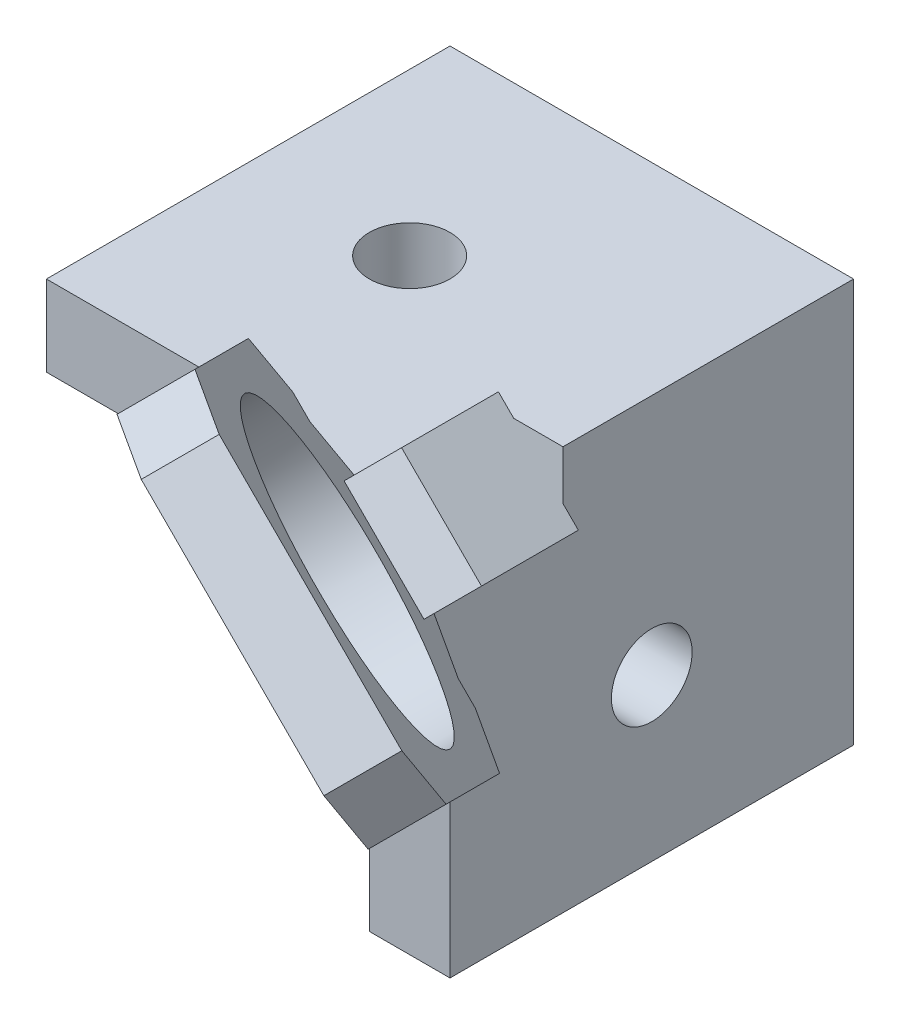
ISO-10303-21;
HEADER;
FILE_DESCRIPTION(('STEP AP214'),'2;1');
FILE_NAME('part.step','',(''),(''),'','','');
FILE_SCHEMA(('AUTOMOTIVE_DESIGN { 1 0 10303 214 1 1 1 1 }'));
ENDSEC;
DATA;
#1=APPLICATION_CONTEXT('core data for automotive mechanical design processes');
#2=APPLICATION_PROTOCOL_DEFINITION('international standard','automotive_design',2000,#1);
#3=PRODUCT_CONTEXT('',#1,'mechanical');
#4=PRODUCT('Part','Part','',(#3));
#5=PRODUCT_RELATED_PRODUCT_CATEGORY('part','',(#4));
#6=PRODUCT_DEFINITION_FORMATION('','',#4);
#7=PRODUCT_DEFINITION_CONTEXT('part definition',#1,'design');
#8=PRODUCT_DEFINITION('design','',#6,#7);
#9=PRODUCT_DEFINITION_SHAPE('','',#8);
#10=(LENGTH_UNIT() NAMED_UNIT(*) SI_UNIT(.MILLI.,.METRE.));
#11=(NAMED_UNIT(*) PLANE_ANGLE_UNIT() SI_UNIT($,.RADIAN.));
#12=(NAMED_UNIT(*) SI_UNIT($,.STERADIAN.) SOLID_ANGLE_UNIT());
#13=UNCERTAINTY_MEASURE_WITH_UNIT(LENGTH_MEASURE(1.E-05),#10,'distance_accuracy_value','');
#14=(GEOMETRIC_REPRESENTATION_CONTEXT(3) GLOBAL_UNCERTAINTY_ASSIGNED_CONTEXT((#13)) GLOBAL_UNIT_ASSIGNED_CONTEXT((#10,
#11,#12)) REPRESENTATION_CONTEXT('',''));
#15=CARTESIAN_POINT('',(0.,0.,0.));
#16=DIRECTION('',(0.,0.,1.));
#17=DIRECTION('',(1.,0.,0.));
#18=AXIS2_PLACEMENT_3D('',#15,#16,#17);
#19=CARTESIAN_POINT('',(0.,0.,25.));
#20=DIRECTION('',(0.,0.,1.));
#21=DIRECTION('',(1.,0.,0.));
#22=AXIS2_PLACEMENT_3D('',#19,#20,#21);
#23=PLANE('',#22);
#24=DIRECTION('',(0.,1.,0.));
#25=VECTOR('',#24,1.);
#26=CARTESIAN_POINT('',(12.5,-12.5,25.));
#27=LINE('',#26,#25);
#28=CARTESIAN_POINT('',(12.5,-12.5,25.));
#29=VERTEX_POINT('',#28);
#30=CARTESIAN_POINT('',(12.5,1.89339828220175,25.));
#31=VERTEX_POINT('',#30);
#32=EDGE_CURVE('E308',#29,#31,#27,.T.);
#33=ORIENTED_EDGE('',*,*,#32,.T.);
#34=DIRECTION('',(-0.707106781186548,0.707106781186547,0.));
#35=VECTOR('',#34,1.);
#36=CARTESIAN_POINT('',(4.72182540694795,9.67157287525379,25.));
#37=LINE('',#36,#35);
#38=CARTESIAN_POINT('',(7.5,6.89339828220174,25.));
#39=VERTEX_POINT('',#38);
#40=EDGE_CURVE('E358',#31,#39,#37,.T.);
#41=ORIENTED_EDGE('',*,*,#40,.T.);
#42=DIRECTION('',(0.,1.,0.));
#43=VECTOR('',#42,1.);
#44=CARTESIAN_POINT('',(7.5,-12.5,25.));
#45=LINE('',#44,#43);
#46=CARTESIAN_POINT('',(7.5,-12.5,25.));
#47=VERTEX_POINT('',#46);
#48=EDGE_CURVE('E265',#47,#39,#45,.T.);
#49=ORIENTED_EDGE('',*,*,#48,.F.);
#50=DIRECTION('',(1.,0.,0.));
#51=VECTOR('',#50,1.);
#52=CARTESIAN_POINT('',(12.5,-12.5,25.));
#53=LINE('',#52,#51);
#54=EDGE_CURVE('E304',#47,#29,#53,.T.);
#55=ORIENTED_EDGE('',*,*,#54,.T.);
#56=EDGE_LOOP('',(#33,#41,#49,#55));
#57=FACE_BOUND('',#56,.T.);
#58=ADVANCED_FACE('F47',(#57),#23,.T.);
#59=CARTESIAN_POINT('',(0.,0.,22.));
#60=DIRECTION('',(0.,0.,1.));
#61=DIRECTION('',(1.,0.,0.));
#62=AXIS2_PLACEMENT_3D('',#59,#60,#61);
#63=PLANE('',#62);
#64=DIRECTION('',(-0.707106781186548,0.707106781186547,0.));
#65=VECTOR('',#64,1.);
#66=CARTESIAN_POINT('',(17.4497474683058,12.5,22.));
#67=LINE('',#66,#65);
#68=CARTESIAN_POINT('',(13.4497474683058,16.5000000000001,22.));
#69=VERTEX_POINT('',#68);
#70=CARTESIAN_POINT('',(12.5,17.4497474683058,22.));
#71=VERTEX_POINT('',#70);
#72=EDGE_CURVE('E779',#69,#71,#67,.T.);
#73=ORIENTED_EDGE('',*,*,#72,.F.);
#74=DIRECTION('',(-1.,0.,0.));
#75=VECTOR('',#74,1.);
#76=CARTESIAN_POINT('',(7.55025253169416,16.5000000000001,22.));
#77=LINE('',#76,#75);
#78=CARTESIAN_POINT('',(11.5502525316942,16.5000000000001,22.));
#79=VERTEX_POINT('',#78);
#80=EDGE_CURVE('E342',#69,#79,#77,.T.);
#81=ORIENTED_EDGE('',*,*,#80,.T.);
#82=DIRECTION('',(-0.707106781186547,-0.707106781186548,0.));
#83=VECTOR('',#82,1.);
#84=CARTESIAN_POINT('',(12.5,17.4497474683058,22.));
#85=LINE('',#84,#83);
#86=EDGE_CURVE('E774',#71,#79,#85,.T.);
#87=ORIENTED_EDGE('',*,*,#86,.F.);
#88=EDGE_LOOP('',(#73,#81,#87));
#89=FACE_BOUND('',#88,.T.);
#90=ADVANCED_FACE('F627',(#89),#63,.F.);
#91=CARTESIAN_POINT('',(12.5,17.4497474683058,22.));
#92=DIRECTION('',(-0.707106781186548,0.707106781186547,0.));
#93=DIRECTION('',(-0.707106781186547,-0.707106781186548,0.));
#94=AXIS2_PLACEMENT_3D('',#91,#92,#93);
#95=PLANE('',#94);
#96=DIRECTION('',(-0.499999999999998,-0.499999999999999,-0.70710678118655));
#97=VECTOR('',#96,1.);
#98=CARTESIAN_POINT('',(8.56244584051399,13.5121933088198,30.4314575050764));
#99=LINE('',#98,#97);
#100=CARTESIAN_POINT('',(7.55025253169416,12.5,29.0000000000001));
#101=VERTEX_POINT('',#100);
#102=CARTESIAN_POINT('',(8.17157287525378,13.1213203435596,29.8786796564404));
#103=VERTEX_POINT('',#102);
#104=EDGE_CURVE('E391',#101,#103,#99,.F.);
#105=ORIENTED_EDGE('',*,*,#104,.T.);
#106=DIRECTION('',(0.499999999999997,0.499999999999998,-0.707106781186551));
#107=VECTOR('',#106,1.);
#108=CARTESIAN_POINT('',(13.1213203435596,18.0710678118655,22.8786796564403));
#109=LINE('',#108,#107);
#110=CARTESIAN_POINT('',(9.52512626584708,14.4748737341529,27.9644660940672));
#111=VERTEX_POINT('',#110);
#112=EDGE_CURVE('E470',#103,#111,#109,.T.);
#113=ORIENTED_EDGE('',*,*,#112,.T.);
#114=DIRECTION('',(0.500000000000002,0.500000000000003,0.707106781186544));
#115=VECTOR('',#114,1.);
#116=CARTESIAN_POINT('',(22.0251262658471,26.974873734153,45.6421356237308));
#117=LINE('',#116,#115);
#118=CARTESIAN_POINT('',(11.0251262658471,15.9748737341529,30.0857864376269));
#119=VERTEX_POINT('',#118);
#120=EDGE_CURVE('E467',#111,#119,#117,.T.);
#121=ORIENTED_EDGE('',*,*,#120,.T.);
#122=DIRECTION('',(-0.499999999999997,-0.499999999999998,0.707106781186551));
#123=VECTOR('',#122,1.);
#124=CARTESIAN_POINT('',(14.6213203435596,19.5710678118655,24.9999999999999));
#125=LINE('',#124,#123);
#126=CARTESIAN_POINT('',(12.5,17.4497474683058,27.9999999999999));
#127=VERTEX_POINT('',#126);
#128=EDGE_CURVE('E255',#127,#119,#125,.T.);
#129=ORIENTED_EDGE('',*,*,#128,.F.);
#130=DIRECTION('',(0.,0.,1.));
#131=VECTOR('',#130,1.);
#132=CARTESIAN_POINT('',(12.5,17.4497474683058,22.));
#133=LINE('',#132,#131);
#134=EDGE_CURVE('E253',#71,#127,#133,.T.);
#135=ORIENTED_EDGE('',*,*,#134,.F.);
#136=ORIENTED_EDGE('',*,*,#86,.T.);
#137=DIRECTION('',(0.577350269189627,0.577350269189628,0.577350269189622));
#138=VECTOR('',#137,1.);
#139=CARTESIAN_POINT('',(7.70016835446279,12.6499158227686,18.1499158227686));
#140=LINE('',#139,#138);
#141=CARTESIAN_POINT('',(7.55025253169416,12.5,18.));
#142=VERTEX_POINT('',#141);
#143=EDGE_CURVE('E361',#79,#142,#140,.F.);
#144=ORIENTED_EDGE('',*,*,#143,.T.);
#145=DIRECTION('',(0.,0.,1.));
#146=VECTOR('',#145,1.);
#147=CARTESIAN_POINT('',(7.55025253169416,12.5,22.));
#148=LINE('',#147,#146);
#149=EDGE_CURVE('E268',#142,#101,#148,.T.);
#150=ORIENTED_EDGE('',*,*,#149,.T.);
#151=EDGE_LOOP('',(#105,#113,#121,#129,#135,#136,#144,#150));
#152=FACE_BOUND('',#151,.T.);
#153=ADVANCED_FACE('F496',(#152),#95,.T.);
#154=CARTESIAN_POINT('',(12.5,7.55025253169417,22.));
#155=DIRECTION('',(0.707106781186548,-0.707106781186547,0.));
#156=DIRECTION('',(0.707106781186547,0.707106781186548,0.));
#157=AXIS2_PLACEMENT_3D('',#154,#155,#156);
#158=PLANE('',#157);
#159=DIRECTION('',(0.499999999999997,0.499999999999998,-0.707106781186551));
#160=VECTOR('',#159,1.);
#161=CARTESIAN_POINT('',(19.8618055378411,14.9120580695353,24.5888347648317));
#162=LINE('',#161,#160);
#163=CARTESIAN_POINT('',(15.9748737341529,11.0251262658471,30.0857864376269));
#164=VERTEX_POINT('',#163);
#165=CARTESIAN_POINT('',(17.4497474683058,12.5,27.9999999999999));
#166=VERTEX_POINT('',#165);
#167=EDGE_CURVE('E231',#164,#166,#162,.T.);
#168=ORIENTED_EDGE('',*,*,#167,.F.);
#169=DIRECTION('',(-0.500000000000002,-0.500000000000003,-0.707106781186544));
#170=VECTOR('',#169,1.);
#171=CARTESIAN_POINT('',(26.974873734153,22.0251262658472,45.6421356237309));
#172=LINE('',#171,#170);
#173=CARTESIAN_POINT('',(14.4748737341529,9.52512626584708,27.9644660940672));
#174=VERTEX_POINT('',#173);
#175=EDGE_CURVE('E464',#164,#174,#172,.T.);
#176=ORIENTED_EDGE('',*,*,#175,.T.);
#177=DIRECTION('',(-0.499999999999997,-0.499999999999998,0.707106781186551));
#178=VECTOR('',#177,1.);
#179=CARTESIAN_POINT('',(15.5961940777125,10.6464466094067,26.3786796564403));
#180=LINE('',#179,#178);
#181=CARTESIAN_POINT('',(13.1213203435596,8.17157287525379,29.8786796564404));
#182=VERTEX_POINT('',#181);
#183=EDGE_CURVE('E461',#174,#182,#180,.T.);
#184=ORIENTED_EDGE('',*,*,#183,.T.);
#185=DIRECTION('',(0.499999999999998,0.499999999999999,0.70710678118655));
#186=VECTOR('',#185,1.);
#187=CARTESIAN_POINT('',(13.5121933088198,8.56244584051399,30.4314575050764));
#188=LINE('',#187,#186);
#189=CARTESIAN_POINT('',(12.5,7.55025253169417,29.0000000000001));
#190=VERTEX_POINT('',#189);
#191=EDGE_CURVE('E374',#182,#190,#188,.F.);
#192=ORIENTED_EDGE('',*,*,#191,.T.);
#193=DIRECTION('',(0.,0.,1.));
#194=VECTOR('',#193,1.);
#195=CARTESIAN_POINT('',(12.5,7.55025253169417,22.));
#196=LINE('',#195,#194);
#197=CARTESIAN_POINT('',(12.5,7.55025253169417,18.));
#198=VERTEX_POINT('',#197);
#199=EDGE_CURVE('E261',#198,#190,#196,.T.);
#200=ORIENTED_EDGE('',*,*,#199,.F.);
#201=DIRECTION('',(-0.577350269189628,-0.577350269189628,-0.577350269189622));
#202=VECTOR('',#201,1.);
#203=CARTESIAN_POINT('',(12.6499158227686,7.7001683544628,18.1499158227686));
#204=LINE('',#203,#202);
#205=CARTESIAN_POINT('',(16.5000000000001,11.5502525316942,22.));
#206=VERTEX_POINT('',#205);
#207=EDGE_CURVE('E371',#198,#206,#204,.F.);
#208=ORIENTED_EDGE('',*,*,#207,.T.);
#209=DIRECTION('',(0.707106781186547,0.707106781186548,0.));
#210=VECTOR('',#209,1.);
#211=CARTESIAN_POINT('',(12.5,7.55025253169417,22.));
#212=LINE('',#211,#210);
#213=CARTESIAN_POINT('',(17.4497474683058,12.5,22.));
#214=VERTEX_POINT('',#213);
#215=EDGE_CURVE('E259',#206,#214,#212,.T.);
#216=ORIENTED_EDGE('',*,*,#215,.T.);
#217=DIRECTION('',(0.,0.,1.));
#218=VECTOR('',#217,1.);
#219=CARTESIAN_POINT('',(17.4497474683058,12.5,22.));
#220=LINE('',#219,#218);
#221=EDGE_CURVE('E250',#214,#166,#220,.T.);
#222=ORIENTED_EDGE('',*,*,#221,.T.);
#223=EDGE_LOOP('',(#168,#176,#184,#192,#200,#208,#216,#222));
#224=FACE_BOUND('',#223,.T.);
#225=ADVANCED_FACE('F257',(#224),#158,.T.);
#226=CARTESIAN_POINT('',(-12.5,-12.5,25.));
#227=DIRECTION('',(1.,0.,0.));
#228=DIRECTION('',(0.,0.,-1.));
#229=AXIS2_PLACEMENT_3D('',#226,#227,#228);
#230=PLANE('',#229);
#231=DIRECTION('',(0.,-1.,0.));
#232=VECTOR('',#231,1.);
#233=CARTESIAN_POINT('',(-12.5,-12.5,0.));
#234=LINE('',#233,#232);
#235=CARTESIAN_POINT('',(-12.5,12.5,0.));
#236=VERTEX_POINT('',#235);
#237=CARTESIAN_POINT('',(-12.5,7.5,0.));
#238=VERTEX_POINT('',#237);
#239=EDGE_CURVE('E294',#236,#238,#234,.T.);
#240=ORIENTED_EDGE('',*,*,#239,.T.);
#241=DIRECTION('',(0.,0.,1.));
#242=VECTOR('',#241,1.);
#243=CARTESIAN_POINT('',(-12.5,7.5,0.));
#244=LINE('',#243,#242);
#245=CARTESIAN_POINT('',(-12.5,7.5,25.));
#246=VERTEX_POINT('',#245);
#247=EDGE_CURVE('E290',#238,#246,#244,.T.);
#248=ORIENTED_EDGE('',*,*,#247,.T.);
#249=DIRECTION('',(0.,-1.,0.));
#250=VECTOR('',#249,1.);
#251=CARTESIAN_POINT('',(-12.5,-12.5,25.));
#252=LINE('',#251,#250);
#253=CARTESIAN_POINT('',(-12.5,12.5,25.));
#254=VERTEX_POINT('',#253);
#255=EDGE_CURVE('E300',#254,#246,#252,.T.);
#256=ORIENTED_EDGE('',*,*,#255,.F.);
#257=DIRECTION('',(0.,0.,-1.));
#258=VECTOR('',#257,1.);
#259=CARTESIAN_POINT('',(-12.5,12.5,25.));
#260=LINE('',#259,#258);
#261=EDGE_CURVE('E315',#254,#236,#260,.T.);
#262=ORIENTED_EDGE('',*,*,#261,.T.);
#263=EDGE_LOOP('',(#240,#248,#256,#262));
#264=FACE_BOUND('',#263,.T.);
#265=ADVANCED_FACE('F588',(#264),#230,.F.);
#266=CARTESIAN_POINT('',(12.5,-12.5,25.));
#267=DIRECTION('',(0.,1.,0.));
#268=DIRECTION('',(-1.,0.,0.));
#269=AXIS2_PLACEMENT_3D('',#266,#267,#268);
#270=PLANE('',#269);
#271=ORIENTED_EDGE('',*,*,#54,.F.);
#272=DIRECTION('',(0.,0.,1.));
#273=VECTOR('',#272,1.);
#274=CARTESIAN_POINT('',(7.5,-12.5,0.));
#275=LINE('',#274,#273);
#276=CARTESIAN_POINT('',(7.5,-12.5,0.));
#277=VERTEX_POINT('',#276);
#278=EDGE_CURVE('E284',#277,#47,#275,.T.);
#279=ORIENTED_EDGE('',*,*,#278,.F.);
#280=DIRECTION('',(1.,0.,0.));
#281=VECTOR('',#280,1.);
#282=CARTESIAN_POINT('',(12.5,-12.5,0.));
#283=LINE('',#282,#281);
#284=CARTESIAN_POINT('',(12.5,-12.5,0.));
#285=VERTEX_POINT('',#284);
#286=EDGE_CURVE('E319',#277,#285,#283,.T.);
#287=ORIENTED_EDGE('',*,*,#286,.T.);
#288=DIRECTION('',(0.,0.,-1.));
#289=VECTOR('',#288,1.);
#290=CARTESIAN_POINT('',(12.5,-12.5,25.));
#291=LINE('',#290,#289);
#292=EDGE_CURVE('E334',#29,#285,#291,.T.);
#293=ORIENTED_EDGE('',*,*,#292,.F.);
#294=EDGE_LOOP('',(#271,#279,#287,#293));
#295=FACE_BOUND('',#294,.T.);
#296=ADVANCED_FACE('F596',(#295),#270,.F.);
#297=CARTESIAN_POINT('',(12.5,-12.5,25.));
#298=DIRECTION('',(-1.,0.,0.));
#299=DIRECTION('',(0.,0.,1.));
#300=AXIS2_PLACEMENT_3D('',#297,#298,#299);
#301=PLANE('',#300);
#302=CARTESIAN_POINT('',(12.5,-2.5,12.5));
#303=DIRECTION('',(-1.,0.,0.));
#304=DIRECTION('',(0.,0.,1.));
#305=AXIS2_PLACEMENT_3D('',#302,#303,#304);
#306=CIRCLE('',#305,2.5);
#307=CARTESIAN_POINT('',(12.5,-2.5,15.));
#308=VERTEX_POINT('',#307);
#309=EDGE_CURVE('E553',#308,#308,#306,.T.);
#310=ORIENTED_EDGE('',*,*,#309,.T.);
#311=EDGE_LOOP('',(#310));
#312=FACE_BOUND('',#311,.T.);
#313=DIRECTION('',(0.,0.,-1.));
#314=VECTOR('',#313,1.);
#315=CARTESIAN_POINT('',(12.5,12.5,25.));
#316=LINE('',#315,#314);
#317=CARTESIAN_POINT('',(12.5,12.5,18.));
#318=VERTEX_POINT('',#317);
#319=CARTESIAN_POINT('',(12.5,12.5,0.));
#320=VERTEX_POINT('',#319);
#321=EDGE_CURVE('E331',#318,#320,#316,.T.);
#322=ORIENTED_EDGE('',*,*,#321,.F.);
#323=DIRECTION('',(0.,-1.,0.));
#324=VECTOR('',#323,1.);
#325=CARTESIAN_POINT('',(12.5,7.55025253169418,18.));
#326=LINE('',#325,#324);
#327=EDGE_CURVE('E349',#318,#198,#326,.T.);
#328=ORIENTED_EDGE('',*,*,#327,.T.);
#329=ORIENTED_EDGE('',*,*,#199,.T.);
#330=DIRECTION('',(0.,0.816496580927724,0.577350269189629));
#331=VECTOR('',#330,1.);
#332=CARTESIAN_POINT('',(12.5,-7.70220057259936,18.2148869802242));
#333=LINE('',#332,#331);
#334=EDGE_CURVE('E377',#190,#31,#333,.F.);
#335=ORIENTED_EDGE('',*,*,#334,.T.);
#336=ORIENTED_EDGE('',*,*,#32,.F.);
#337=ORIENTED_EDGE('',*,*,#292,.T.);
#338=DIRECTION('',(0.,1.,0.));
#339=VECTOR('',#338,1.);
#340=CARTESIAN_POINT('',(12.5,-12.5,0.));
#341=LINE('',#340,#339);
#342=EDGE_CURVE('E322',#285,#320,#341,.T.);
#343=ORIENTED_EDGE('',*,*,#342,.T.);
#344=EDGE_LOOP('',(#322,#328,#329,#335,#336,#337,#343));
#345=FACE_BOUND('',#344,.T.);
#346=ADVANCED_FACE('F601',(#312,#345),#301,.F.);
#347=CARTESIAN_POINT('',(12.5,12.5,25.));
#348=DIRECTION('',(0.,-1.,0.));
#349=DIRECTION('',(1.,0.,0.));
#350=AXIS2_PLACEMENT_3D('',#347,#348,#349);
#351=PLANE('',#350);
#352=CARTESIAN_POINT('',(-2.5,12.5,12.5));
#353=DIRECTION('',(0.,-1.,0.));
#354=DIRECTION('',(1.,0.,0.));
#355=AXIS2_PLACEMENT_3D('',#352,#353,#354);
#356=CIRCLE('',#355,2.5);
#357=CARTESIAN_POINT('',(0.,12.5,12.5));
#358=VERTEX_POINT('',#357);
#359=EDGE_CURVE('E401',#358,#358,#356,.T.);
#360=ORIENTED_EDGE('',*,*,#359,.T.);
#361=EDGE_LOOP('',(#360));
#362=FACE_BOUND('',#361,.T.);
#363=ORIENTED_EDGE('',*,*,#149,.F.);
#364=DIRECTION('',(1.,0.,0.));
#365=VECTOR('',#364,1.);
#366=CARTESIAN_POINT('',(12.5,12.5,18.));
#367=LINE('',#366,#365);
#368=EDGE_CURVE('E346',#142,#318,#367,.T.);
#369=ORIENTED_EDGE('',*,*,#368,.T.);
#370=ORIENTED_EDGE('',*,*,#321,.T.);
#371=DIRECTION('',(-1.,0.,0.));
#372=VECTOR('',#371,1.);
#373=CARTESIAN_POINT('',(12.5,12.5,0.));
#374=LINE('',#373,#372);
#375=EDGE_CURVE('E305',#320,#236,#374,.T.);
#376=ORIENTED_EDGE('',*,*,#375,.T.);
#377=ORIENTED_EDGE('',*,*,#261,.F.);
#378=DIRECTION('',(-1.,0.,0.));
#379=VECTOR('',#378,1.);
#380=CARTESIAN_POINT('',(12.5,12.5,25.));
#381=LINE('',#380,#379);
#382=CARTESIAN_POINT('',(1.89339828220173,12.5,25.));
#383=VERTEX_POINT('',#382);
#384=EDGE_CURVE('E312',#383,#254,#381,.T.);
#385=ORIENTED_EDGE('',*,*,#384,.F.);
#386=DIRECTION('',(-0.816496580927724,0.,-0.577350269189628));
#387=VECTOR('',#386,1.);
#388=CARTESIAN_POINT('',(8.96446609406721,12.5,30.));
#389=LINE('',#388,#387);
#390=EDGE_CURVE('E387',#383,#101,#389,.F.);
#391=ORIENTED_EDGE('',*,*,#390,.T.);
#392=EDGE_LOOP('',(#363,#369,#370,#376,#377,#385,#391));
#393=FACE_BOUND('',#392,.T.);
#394=ADVANCED_FACE('F636',(#362,#393),#351,.F.);
#395=DIRECTION('',(-1.,0.,0.));
#396=VECTOR('',#395,1.);
#397=CARTESIAN_POINT('',(-12.5,7.5,25.));
#398=LINE('',#397,#396);
#399=CARTESIAN_POINT('',(6.89339828220174,7.5,25.));
#400=VERTEX_POINT('',#399);
#401=EDGE_CURVE('E280',#400,#246,#398,.T.);
#402=ORIENTED_EDGE('',*,*,#401,.F.);
#403=DIRECTION('',(-0.707106781186548,0.707106781186547,0.));
#404=VECTOR('',#403,1.);
#405=CARTESIAN_POINT('',(4.72182540694795,9.67157287525379,25.));
#406=LINE('',#405,#404);
#407=EDGE_CURVE('E355',#400,#383,#406,.T.);
#408=ORIENTED_EDGE('',*,*,#407,.T.);
#409=ORIENTED_EDGE('',*,*,#384,.T.);
#410=ORIENTED_EDGE('',*,*,#255,.T.);
#411=EDGE_LOOP('',(#402,#408,#409,#410));
#412=FACE_BOUND('',#411,.T.);
#413=ADVANCED_FACE('F583',(#412),#23,.T.);
#414=CARTESIAN_POINT('',(0.,0.,0.));
#415=DIRECTION('',(0.,0.,1.));
#416=DIRECTION('',(1.,0.,0.));
#417=AXIS2_PLACEMENT_3D('',#414,#415,#416);
#418=PLANE('',#417);
#419=DIRECTION('',(0.,1.,0.));
#420=VECTOR('',#419,1.);
#421=CARTESIAN_POINT('',(7.5,-12.5,0.));
#422=LINE('',#421,#420);
#423=CARTESIAN_POINT('',(7.5,7.5,0.));
#424=VERTEX_POINT('',#423);
#425=EDGE_CURVE('E275',#277,#424,#422,.T.);
#426=ORIENTED_EDGE('',*,*,#425,.T.);
#427=DIRECTION('',(-1.,0.,0.));
#428=VECTOR('',#427,1.);
#429=CARTESIAN_POINT('',(-12.5,7.5,0.));
#430=LINE('',#429,#428);
#431=EDGE_CURVE('E279',#424,#238,#430,.T.);
#432=ORIENTED_EDGE('',*,*,#431,.T.);
#433=ORIENTED_EDGE('',*,*,#239,.F.);
#434=ORIENTED_EDGE('',*,*,#375,.F.);
#435=ORIENTED_EDGE('',*,*,#342,.F.);
#436=ORIENTED_EDGE('',*,*,#286,.F.);
#437=EDGE_LOOP('',(#426,#432,#433,#434,#435,#436));
#438=FACE_BOUND('',#437,.T.);
#439=ADVANCED_FACE('F591',(#438),#418,.F.);
#440=CARTESIAN_POINT('',(-12.5,7.5,0.));
#441=DIRECTION('',(0.,1.,0.));
#442=DIRECTION('',(0.,0.,1.));
#443=AXIS2_PLACEMENT_3D('',#440,#441,#442);
#444=PLANE('',#443);
#445=CARTESIAN_POINT('',(-2.5,7.5,12.5));
#446=DIRECTION('',(0.,-1.,0.));
#447=DIRECTION('',(0.,0.,-1.));
#448=AXIS2_PLACEMENT_3D('',#445,#446,#447);
#449=CIRCLE('',#448,2.5);
#450=CARTESIAN_POINT('',(-2.5,7.5,10.));
#451=VERTEX_POINT('',#450);
#452=EDGE_CURVE('E549',#451,#451,#449,.T.);
#453=ORIENTED_EDGE('',*,*,#452,.F.);
#454=EDGE_LOOP('',(#453));
#455=FACE_BOUND('',#454,.T.);
#456=DIRECTION('',(0.,0.,1.));
#457=VECTOR('',#456,1.);
#458=CARTESIAN_POINT('',(7.5,7.5,0.));
#459=LINE('',#458,#457);
#460=CARTESIAN_POINT('',(7.5,7.5,25.4289321881346));
#461=VERTEX_POINT('',#460);
#462=EDGE_CURVE('E295',#424,#461,#459,.T.);
#463=ORIENTED_EDGE('',*,*,#462,.T.);
#464=DIRECTION('',(0.816496580927724,0.,0.577350269189628));
#465=VECTOR('',#464,1.);
#466=CARTESIAN_POINT('',(-17.8206469257085,7.5,7.52453104293564));
#467=LINE('',#466,#465);
#468=EDGE_CURVE('E384',#461,#400,#467,.F.);
#469=ORIENTED_EDGE('',*,*,#468,.T.);
#470=ORIENTED_EDGE('',*,*,#401,.T.);
#471=ORIENTED_EDGE('',*,*,#247,.F.);
#472=ORIENTED_EDGE('',*,*,#431,.F.);
#473=EDGE_LOOP('',(#463,#469,#470,#471,#472));
#474=FACE_BOUND('',#473,.T.);
#475=ADVANCED_FACE('F569',(#455,#474),#444,.F.);
#476=CARTESIAN_POINT('',(7.5,-12.5,0.));
#477=DIRECTION('',(1.,0.,0.));
#478=DIRECTION('',(0.,0.,-1.));
#479=AXIS2_PLACEMENT_3D('',#476,#477,#478);
#480=PLANE('',#479);
#481=CARTESIAN_POINT('',(7.5,-2.5,12.5));
#482=DIRECTION('',(-1.,0.,0.));
#483=DIRECTION('',(0.,0.,1.));
#484=AXIS2_PLACEMENT_3D('',#481,#482,#483);
#485=CIRCLE('',#484,2.5);
#486=CARTESIAN_POINT('',(7.5,-2.5,15.));
#487=VERTEX_POINT('',#486);
#488=EDGE_CURVE('E557',#487,#487,#485,.T.);
#489=ORIENTED_EDGE('',*,*,#488,.F.);
#490=EDGE_LOOP('',(#489));
#491=FACE_BOUND('',#490,.T.);
#492=ORIENTED_EDGE('',*,*,#48,.T.);
#493=DIRECTION('',(0.,-0.816496580927724,-0.577350269189629));
#494=VECTOR('',#493,1.);
#495=CARTESIAN_POINT('',(7.5,-17.8206469257085,7.52453104293562));
#496=LINE('',#495,#494);
#497=EDGE_CURVE('E380',#39,#461,#496,.F.);
#498=ORIENTED_EDGE('',*,*,#497,.T.);
#499=ORIENTED_EDGE('',*,*,#462,.F.);
#500=ORIENTED_EDGE('',*,*,#425,.F.);
#501=ORIENTED_EDGE('',*,*,#278,.T.);
#502=EDGE_LOOP('',(#492,#498,#499,#500,#501));
#503=FACE_BOUND('',#502,.T.);
#504=ADVANCED_FACE('F565',(#491,#503),#480,.F.);
#505=ORIENTED_EDGE('',*,*,#215,.F.);
#506=DIRECTION('',(0.,1.,0.));
#507=VECTOR('',#506,1.);
#508=CARTESIAN_POINT('',(16.5000000000001,12.5,22.));
#509=LINE('',#508,#507);
#510=CARTESIAN_POINT('',(16.5000000000001,13.4497474683058,22.));
#511=VERTEX_POINT('',#510);
#512=EDGE_CURVE('E339',#206,#511,#509,.T.);
#513=ORIENTED_EDGE('',*,*,#512,.T.);
#514=EDGE_CURVE('E274',#214,#511,#67,.T.);
#515=ORIENTED_EDGE('',*,*,#514,.F.);
#516=EDGE_LOOP('',(#505,#513,#515));
#517=FACE_BOUND('',#516,.T.);
#518=ADVANCED_FACE('F568',(#517),#63,.F.);
#519=CARTESIAN_POINT('',(17.4497474683058,12.5,22.));
#520=DIRECTION('',(0.707106781186547,0.707106781186548,0.));
#521=DIRECTION('',(-0.707106781186548,0.707106781186547,0.));
#522=AXIS2_PLACEMENT_3D('',#519,#520,#521);
#523=PLANE('',#522);
#524=DIRECTION('',(0.707106781186548,-0.707106781186547,0.));
#525=VECTOR('',#524,1.);
#526=CARTESIAN_POINT('',(10.3786796564404,19.5710678118655,27.9999999999999));
#527=LINE('',#526,#525);
#528=EDGE_CURVE('E235',#127,#166,#527,.T.);
#529=ORIENTED_EDGE('',*,*,#528,.T.);
#530=ORIENTED_EDGE('',*,*,#221,.F.);
#531=ORIENTED_EDGE('',*,*,#514,.T.);
#532=DIRECTION('',(0.577350269189628,-0.577350269189627,0.577350269189622));
#533=VECTOR('',#532,1.);
#534=CARTESIAN_POINT('',(20.983249156102,8.96649831220382,26.4832491561019));
#535=LINE('',#534,#533);
#536=CARTESIAN_POINT('',(14.9748737341529,14.9748737341529,20.4748737341529));
#537=VERTEX_POINT('',#536);
#538=EDGE_CURVE('E368',#511,#537,#535,.F.);
#539=ORIENTED_EDGE('',*,*,#538,.T.);
#540=DIRECTION('',(0.577350269189628,-0.577350269189628,-0.577350269189622));
#541=VECTOR('',#540,1.);
#542=CARTESIAN_POINT('',(8.9664983122038,20.983249156102,26.4832491561019));
#543=LINE('',#542,#541);
#544=EDGE_CURVE('E365',#537,#69,#543,.F.);
#545=ORIENTED_EDGE('',*,*,#544,.T.);
#546=ORIENTED_EDGE('',*,*,#72,.T.);
#547=ORIENTED_EDGE('',*,*,#134,.T.);
#548=EDGE_LOOP('',(#529,#530,#531,#539,#545,#546,#547));
#549=FACE_BOUND('',#548,.T.);
#550=ADVANCED_FACE('F248',(#549),#523,.T.);
#551=CARTESIAN_POINT('',(12.7907377259756,21.9831258814007,24.5888347648317));
#552=DIRECTION('',(-0.500000000000002,-0.500000000000003,-0.707106781186544));
#553=DIRECTION('',(0.,0.816496580927723,-0.57735026918963));
#554=AXIS2_PLACEMENT_3D('',#551,#552,#553);
#555=PLANE('',#554);
#556=ORIENTED_EDGE('',*,*,#128,.T.);
#557=DIRECTION('',(0.707106781186547,-0.707106781186548,0.));
#558=VECTOR('',#557,1.);
#559=CARTESIAN_POINT('',(13.5,13.5,30.0857864376269));
#560=LINE('',#559,#558);
#561=EDGE_CURVE('E238',#119,#164,#560,.T.);
#562=ORIENTED_EDGE('',*,*,#561,.T.);
#563=ORIENTED_EDGE('',*,*,#167,.T.);
#564=ORIENTED_EDGE('',*,*,#528,.F.);
#565=EDGE_LOOP('',(#556,#562,#563,#564));
#566=FACE_BOUND('',#565,.T.);
#567=ADVANCED_FACE('F234',(#566),#555,.F.);
#568=CARTESIAN_POINT('',(17.3869318036882,17.3869318036882,24.5888347648317));
#569=DIRECTION('',(0.500000000000002,0.500000000000003,0.707106781186544));
#570=DIRECTION('',(0.,-0.816496580927723,0.57735026918963));
#571=AXIS2_PLACEMENT_3D('',#568,#569,#570);
#572=PLANE('',#571);
#573=DIRECTION('',(0.70710678118655,-0.707106781186545,0.));
#574=VECTOR('',#573,1.);
#575=CARTESIAN_POINT('',(11.5000000000001,11.5,32.914213562373));
#576=LINE('',#575,#574);
#577=CARTESIAN_POINT('',(5.84314575050767,17.1568542494924,32.9142135623731));
#578=VERTEX_POINT('',#577);
#579=CARTESIAN_POINT('',(6.90380592228744,16.0961940777126,32.9142135623731));
#580=VERTEX_POINT('',#579);
#581=EDGE_CURVE('E517',#578,#580,#576,.T.);
#582=ORIENTED_EDGE('',*,*,#581,.F.);
#583=DIRECTION('',(0.499999999999994,0.500000000000001,-0.707106781186551));
#584=VECTOR('',#583,1.);
#585=CARTESIAN_POINT('',(7.84314575050765,19.1568542494924,30.0857864376269));
#586=LINE('',#585,#584);
#587=CARTESIAN_POINT('',(7.84314575050764,19.1568542494924,30.0857864376269));
#588=VERTEX_POINT('',#587);
#589=EDGE_CURVE('E449',#578,#588,#586,.T.);
#590=ORIENTED_EDGE('',*,*,#589,.T.);
#591=CARTESIAN_POINT('',(8.90380592228742,18.0961940777126,30.0857864376269));
#592=VERTEX_POINT('',#591);
#593=EDGE_CURVE('E504',#588,#592,#560,.T.);
#594=ORIENTED_EDGE('',*,*,#593,.T.);
#595=DIRECTION('',(-0.499999999999997,-0.499999999999998,0.707106781186551));
#596=VECTOR('',#595,1.);
#597=CARTESIAN_POINT('',(12.7907377259756,21.9831258814008,24.5888347648317));
#598=LINE('',#597,#596);
#599=EDGE_CURVE('E445',#592,#580,#598,.T.);
#600=ORIENTED_EDGE('',*,*,#599,.T.);
#601=EDGE_LOOP('',(#582,#590,#594,#600));
#602=FACE_BOUND('',#601,.T.);
#603=ADVANCED_FACE('F507',(#602),#572,.F.);
#604=CARTESIAN_POINT('',(18.0961940777126,8.90380592228742,30.0857864376269));
#605=VERTEX_POINT('',#604);
#606=CARTESIAN_POINT('',(19.1568542494924,7.84314575050761,30.0857864376269));
#607=VERTEX_POINT('',#606);
#608=EDGE_CURVE('E512',#605,#607,#560,.T.);
#609=ORIENTED_EDGE('',*,*,#608,.T.);
#610=DIRECTION('',(-0.499999999999997,-0.499999999999998,0.707106781186551));
#611=VECTOR('',#610,1.);
#612=CARTESIAN_POINT('',(17.1568542494924,5.84314575050765,32.914213562373));
#613=LINE('',#612,#611);
#614=CARTESIAN_POINT('',(17.1568542494925,5.84314575050767,32.914213562373));
#615=VERTEX_POINT('',#614);
#616=EDGE_CURVE('E457',#607,#615,#613,.T.);
#617=ORIENTED_EDGE('',*,*,#616,.T.);
#618=CARTESIAN_POINT('',(16.0961940777126,6.90380592228748,32.914213562373));
#619=VERTEX_POINT('',#618);
#620=EDGE_CURVE('E511',#619,#615,#576,.T.);
#621=ORIENTED_EDGE('',*,*,#620,.F.);
#622=DIRECTION('',(0.499999999999997,0.499999999999998,-0.707106781186551));
#623=VECTOR('',#622,1.);
#624=CARTESIAN_POINT('',(21.9831258814008,12.7907377259756,24.5888347648317));
#625=LINE('',#624,#623);
#626=EDGE_CURVE('E453',#619,#605,#625,.T.);
#627=ORIENTED_EDGE('',*,*,#626,.T.);
#628=EDGE_LOOP('',(#609,#617,#621,#627));
#629=FACE_BOUND('',#628,.T.);
#630=ADVANCED_FACE('F733',(#629),#572,.F.);
#631=CARTESIAN_POINT('',(24.5,24.5000000000001,45.6421356237308));
#632=DIRECTION('',(0.499999999999998,0.499999999999997,-0.707106781186551));
#633=DIRECTION('',(-0.816496580927728,0.,-0.577350269189622));
#634=AXIS2_PLACEMENT_3D('',#631,#632,#633);
#635=PLANE('',#634);
#636=CARTESIAN_POINT('',(19.,19.,37.8639610306789));
#637=DIRECTION('',(0.499999999999998,0.499999999999997,-0.707106781186551));
#638=DIRECTION('',(-0.816496580927728,0.,-0.577350269189622));
#639=AXIS2_PLACEMENT_3D('',#636,#637,#638);
#640=CIRCLE('',#639,9.);
#641=CARTESIAN_POINT('',(11.6515307716505,19.,32.6678086079723));
#642=VERTEX_POINT('',#641);
#643=EDGE_CURVE('E520',#642,#642,#640,.T.);
#644=ORIENTED_EDGE('',*,*,#643,.F.);
#645=EDGE_LOOP('',(#644));
#646=FACE_BOUND('',#645,.T.);
#647=DIRECTION('',(-0.500000000000002,-0.500000000000003,-0.707106781186544));
#648=VECTOR('',#647,1.);
#649=CARTESIAN_POINT('',(16.721825406948,32.2781745930521,45.6421356237308));
#650=LINE('',#649,#648);
#651=CARTESIAN_POINT('',(15.221825406948,30.7781745930521,43.5208152801712));
#652=VERTEX_POINT('',#651);
#653=CARTESIAN_POINT('',(7.22182540694801,22.778174593052,32.2071067811865));
#654=VERTEX_POINT('',#653);
#655=EDGE_CURVE('E243',#652,#654,#650,.T.);
#656=ORIENTED_EDGE('',*,*,#655,.F.);
#657=DIRECTION('',(-0.853553390593276,0.146446609406726,-0.499999999999997));
#658=VECTOR('',#657,1.);
#659=CARTESIAN_POINT('',(23.6715728752539,29.3284271247462,48.470562748477));
#660=LINE('',#659,#658);
#661=CARTESIAN_POINT('',(18.8431457505077,30.1568542494924,45.6421356237308));
#662=VERTEX_POINT('',#661);
#663=EDGE_CURVE('E417',#652,#662,#660,.F.);
#664=ORIENTED_EDGE('',*,*,#663,.T.);
#665=DIRECTION('',(0.707106781186547,-0.707106781186548,0.));
#666=VECTOR('',#665,1.);
#667=CARTESIAN_POINT('',(24.5,24.5000000000001,45.6421356237308));
#668=LINE('',#667,#666);
#669=CARTESIAN_POINT('',(30.1568542494924,18.8431457505077,45.6421356237309));
#670=VERTEX_POINT('',#669);
#671=EDGE_CURVE('E529',#662,#670,#668,.T.);
#672=ORIENTED_EDGE('',*,*,#671,.T.);
#673=DIRECTION('',(-0.146446609406727,0.853553390593276,0.499999999999995));
#674=VECTOR('',#673,1.);
#675=CARTESIAN_POINT('',(29.3284271247462,23.6715728752539,48.470562748477));
#676=LINE('',#675,#674);
#677=CARTESIAN_POINT('',(30.7781745930521,15.2218254069481,43.5208152801712));
#678=VERTEX_POINT('',#677);
#679=EDGE_CURVE('E414',#670,#678,#676,.F.);
#680=ORIENTED_EDGE('',*,*,#679,.T.);
#681=DIRECTION('',(-0.500000000000002,-0.500000000000003,-0.707106781186544));
#682=VECTOR('',#681,1.);
#683=CARTESIAN_POINT('',(32.2781745930521,16.7218254069481,45.6421356237308));
#684=LINE('',#683,#682);
#685=CARTESIAN_POINT('',(22.778174593052,7.22182540694801,32.2071067811865));
#686=VERTEX_POINT('',#685);
#687=EDGE_CURVE('E538',#678,#686,#684,.T.);
#688=ORIENTED_EDGE('',*,*,#687,.T.);
#689=DIRECTION('',(-0.853553390593275,0.146446609406723,-0.499999999999999));
#690=VECTOR('',#689,1.);
#691=CARTESIAN_POINT('',(27.6066017177983,6.39339828220181,35.0355339059327));
#692=LINE('',#691,#690);
#693=EDGE_CURVE('E408',#686,#607,#692,.T.);
#694=ORIENTED_EDGE('',*,*,#693,.T.);
#695=ORIENTED_EDGE('',*,*,#608,.F.);
#696=DIRECTION('',(-0.853553390593276,0.146446609406729,-0.499999999999996));
#697=VECTOR('',#696,1.);
#698=CARTESIAN_POINT('',(18.0961940777126,8.90380592228743,30.0857864376269));
#699=LINE('',#698,#697);
#700=EDGE_CURVE('E474',#605,#174,#699,.T.);
#701=ORIENTED_EDGE('',*,*,#700,.T.);
#702=ORIENTED_EDGE('',*,*,#175,.F.);
#703=ORIENTED_EDGE('',*,*,#561,.F.);
#704=ORIENTED_EDGE('',*,*,#120,.F.);
#705=DIRECTION('',(-0.146446609406729,0.853553390593277,0.499999999999994));
#706=VECTOR('',#705,1.);
#707=CARTESIAN_POINT('',(8.90380592228742,18.0961940777126,30.0857864376269));
#708=LINE('',#707,#706);
#709=EDGE_CURVE('E11',#111,#592,#708,.T.);
#710=ORIENTED_EDGE('',*,*,#709,.T.);
#711=ORIENTED_EDGE('',*,*,#593,.F.);
#712=DIRECTION('',(-0.146446609406723,0.853553390593276,0.499999999999998));
#713=VECTOR('',#712,1.);
#714=CARTESIAN_POINT('',(6.39339828220183,27.6066017177983,35.0355339059327));
#715=LINE('',#714,#713);
#716=EDGE_CURVE('E411',#588,#654,#715,.T.);
#717=ORIENTED_EDGE('',*,*,#716,.T.);
#718=EDGE_LOOP('',(#656,#664,#672,#680,#688,#694,#695,#701,#702,#703,#704,#710,#711,#717));
#719=FACE_BOUND('',#718,.T.);
#720=ADVANCED_FACE('F503',(#646,#719),#635,.T.);
#721=CARTESIAN_POINT('',(20.6087572106362,36.1651063967403,40.1451839509357));
#722=DIRECTION('',(-0.70710678118655,0.707106781186545,0.));
#723=DIRECTION('',(-0.707106781186545,-0.70710678118655,0.));
#724=AXIS2_PLACEMENT_3D('',#721,#722,#723);
#725=PLANE('',#724);
#726=DIRECTION('',(-0.500000000000002,-0.500000000000003,-0.707106781186544));
#727=VECTOR('',#726,1.);
#728=CARTESIAN_POINT('',(14.7218254069481,30.2781745930521,48.4705627484771));
#729=LINE('',#728,#727);
#730=CARTESIAN_POINT('',(13.2218254069481,28.7781745930521,46.3492424049174));
#731=VERTEX_POINT('',#730);
#732=CARTESIAN_POINT('',(5.22182540694803,20.778174593052,35.0355339059327));
#733=VERTEX_POINT('',#732);
#734=EDGE_CURVE('E759',#731,#733,#729,.T.);
#735=ORIENTED_EDGE('',*,*,#734,.F.);
#736=DIRECTION('',(0.499999999999994,0.500000000000001,-0.707106781186551));
#737=VECTOR('',#736,1.);
#738=CARTESIAN_POINT('',(19.1087572106362,34.6651063967403,38.0238636073761));
#739=LINE('',#738,#737);
#740=EDGE_CURVE('E404',#731,#652,#739,.T.);
#741=ORIENTED_EDGE('',*,*,#740,.T.);
#742=ORIENTED_EDGE('',*,*,#655,.T.);
#743=DIRECTION('',(-0.499999999999994,-0.500000000000001,0.707106781186551));
#744=VECTOR('',#743,1.);
#745=CARTESIAN_POINT('',(5.22182540694802,20.778174593052,35.0355339059327));
#746=LINE('',#745,#744);
#747=EDGE_CURVE('E395',#654,#733,#746,.T.);
#748=ORIENTED_EDGE('',*,*,#747,.T.);
#749=EDGE_LOOP('',(#735,#741,#742,#748));
#750=FACE_BOUND('',#749,.T.);
#751=ADVANCED_FACE('F732',(#750),#725,.T.);
#752=CARTESIAN_POINT('',(22.5000000000001,22.5000000000001,48.470562748477));
#753=DIRECTION('',(0.499999999999994,0.500000000000001,-0.707106781186551));
#754=DIRECTION('',(0.,0.816496580927726,0.577350269189625));
#755=AXIS2_PLACEMENT_3D('',#752,#753,#754);
#756=PLANE('',#755);
#757=CARTESIAN_POINT('',(17.0000000000001,17.,40.692388155425));
#758=DIRECTION('',(-0.499999999999994,-0.500000000000001,0.707106781186551));
#759=DIRECTION('',(0.,-0.816496580927727,-0.577350269189625));
#760=AXIS2_PLACEMENT_3D('',#757,#758,#759);
#761=CIRCLE('',#760,9.);
#762=CARTESIAN_POINT('',(17.0000000000001,9.65153077165051,35.4962357327184));
#763=VERTEX_POINT('',#762);
#764=EDGE_CURVE('E400',#763,#763,#761,.T.);
#765=ORIENTED_EDGE('',*,*,#764,.F.);
#766=EDGE_LOOP('',(#765));
#767=FACE_BOUND('',#766,.T.);
#768=DIRECTION('',(0.70710678118655,-0.707106781186545,0.));
#769=VECTOR('',#768,1.);
#770=CARTESIAN_POINT('',(22.5000000000001,22.5000000000001,48.470562748477));
#771=LINE('',#770,#769);
#772=CARTESIAN_POINT('',(16.8431457505077,28.1568542494924,48.470562748477));
#773=VERTEX_POINT('',#772);
#774=CARTESIAN_POINT('',(28.1568542494925,16.8431457505078,48.470562748477));
#775=VERTEX_POINT('',#774);
#776=EDGE_CURVE('E532',#773,#775,#771,.T.);
#777=ORIENTED_EDGE('',*,*,#776,.F.);
#778=DIRECTION('',(0.853553390593278,-0.146446609406724,0.499999999999994));
#779=VECTOR('',#778,1.);
#780=CARTESIAN_POINT('',(13.2218254069481,28.7781745930521,46.3492424049174));
#781=LINE('',#780,#779);
#782=EDGE_CURVE('E435',#773,#731,#781,.F.);
#783=ORIENTED_EDGE('',*,*,#782,.T.);
#784=ORIENTED_EDGE('',*,*,#734,.T.);
#785=DIRECTION('',(0.146446609406725,-0.853553390593274,-0.500000000000001));
#786=VECTOR('',#785,1.);
#787=CARTESIAN_POINT('',(5.84314575050767,17.1568542494924,32.9142135623731));
#788=LINE('',#787,#786);
#789=EDGE_CURVE('E429',#733,#578,#788,.T.);
#790=ORIENTED_EDGE('',*,*,#789,.T.);
#791=ORIENTED_EDGE('',*,*,#581,.T.);
#792=EDGE_CURVE('E338',#580,#619,#576,.T.);
#793=ORIENTED_EDGE('',*,*,#792,.T.);
#794=ORIENTED_EDGE('',*,*,#620,.T.);
#795=DIRECTION('',(0.853553390593277,-0.14644660940672,0.499999999999996));
#796=VECTOR('',#795,1.);
#797=CARTESIAN_POINT('',(17.1568542494925,5.84314575050766,32.914213562373));
#798=LINE('',#797,#796);
#799=CARTESIAN_POINT('',(20.778174593052,5.22182540694803,35.0355339059327));
#800=VERTEX_POINT('',#799);
#801=EDGE_CURVE('E426',#615,#800,#798,.T.);
#802=ORIENTED_EDGE('',*,*,#801,.T.);
#803=DIRECTION('',(-0.500000000000002,-0.500000000000003,-0.707106781186544));
#804=VECTOR('',#803,1.);
#805=CARTESIAN_POINT('',(30.2781745930521,14.7218254069481,48.470562748477));
#806=LINE('',#805,#804);
#807=CARTESIAN_POINT('',(28.7781745930521,13.2218254069481,46.3492424049174));
#808=VERTEX_POINT('',#807);
#809=EDGE_CURVE('E764',#808,#800,#806,.T.);
#810=ORIENTED_EDGE('',*,*,#809,.F.);
#811=DIRECTION('',(0.146446609406729,-0.853553390593274,-0.499999999999999));
#812=VECTOR('',#811,1.);
#813=CARTESIAN_POINT('',(28.7781745930521,13.2218254069481,46.3492424049173));
#814=LINE('',#813,#812);
#815=EDGE_CURVE('E432',#808,#775,#814,.F.);
#816=ORIENTED_EDGE('',*,*,#815,.T.);
#817=EDGE_LOOP('',(#777,#783,#784,#790,#791,#793,#794,#802,#810,#816));
#818=FACE_BOUND('',#817,.T.);
#819=ADVANCED_FACE('F737',(#767,#818),#756,.F.);
#820=CARTESIAN_POINT('',(36.1651063967402,20.6087572106362,40.1451839509356));
#821=DIRECTION('',(0.707106781186548,-0.707106781186547,0.));
#822=DIRECTION('',(0.707106781186547,0.707106781186548,0.));
#823=AXIS2_PLACEMENT_3D('',#820,#821,#822);
#824=PLANE('',#823);
#825=ORIENTED_EDGE('',*,*,#687,.F.);
#826=DIRECTION('',(-0.499999999999997,-0.499999999999998,0.707106781186551));
#827=VECTOR('',#826,1.);
#828=CARTESIAN_POINT('',(34.6651063967402,19.1087572106362,38.023863607376));
#829=LINE('',#828,#827);
#830=EDGE_CURVE('E441',#678,#808,#829,.T.);
#831=ORIENTED_EDGE('',*,*,#830,.T.);
#832=ORIENTED_EDGE('',*,*,#809,.T.);
#833=DIRECTION('',(0.499999999999997,0.499999999999998,-0.707106781186551));
#834=VECTOR('',#833,1.);
#835=CARTESIAN_POINT('',(22.778174593052,7.22182540694801,32.2071067811865));
#836=LINE('',#835,#834);
#837=EDGE_CURVE('E438',#800,#686,#836,.T.);
#838=ORIENTED_EDGE('',*,*,#837,.T.);
#839=EDGE_LOOP('',(#825,#831,#832,#838));
#840=FACE_BOUND('',#839,.T.);
#841=ADVANCED_FACE('F741',(#840),#824,.T.);
#842=CARTESIAN_POINT('',(28.3869318036882,28.3869318036883,40.1451839509357));
#843=DIRECTION('',(0.500000000000002,0.500000000000003,0.707106781186544));
#844=DIRECTION('',(0.,-0.816496580927723,0.57735026918963));
#845=AXIS2_PLACEMENT_3D('',#842,#843,#844);
#846=PLANE('',#845);
#847=ORIENTED_EDGE('',*,*,#671,.F.);
#848=DIRECTION('',(-0.499999999999994,-0.500000000000001,0.707106781186551));
#849=VECTOR('',#848,1.);
#850=CARTESIAN_POINT('',(22.7300775541958,34.0437860531806,40.1451839509357));
#851=LINE('',#850,#849);
#852=EDGE_CURVE('E423',#662,#773,#851,.T.);
#853=ORIENTED_EDGE('',*,*,#852,.T.);
#854=ORIENTED_EDGE('',*,*,#776,.T.);
#855=DIRECTION('',(0.499999999999997,0.499999999999998,-0.707106781186551));
#856=VECTOR('',#855,1.);
#857=CARTESIAN_POINT('',(34.0437860531806,22.7300775541959,40.1451839509357));
#858=LINE('',#857,#856);
#859=EDGE_CURVE('E420',#775,#670,#858,.T.);
#860=ORIENTED_EDGE('',*,*,#859,.T.);
#861=EDGE_LOOP('',(#847,#853,#854,#860));
#862=FACE_BOUND('',#861,.T.);
#863=ADVANCED_FACE('F622',(#862),#846,.T.);
#864=CARTESIAN_POINT('',(39.0260191002139,39.0260191002142,9.54289321881321));
#865=DIRECTION('',(-0.499999999999994,-0.500000000000001,0.707106781186551));
#866=DIRECTION('',(0.,-0.816496580927727,-0.577350269189625));
#867=AXIS2_PLACEMENT_3D('',#864,#865,#866);
#868=CYLINDRICAL_SURFACE('',#867,9.);
#869=ORIENTED_EDGE('',*,*,#643,.T.);
#870=EDGE_LOOP('',(#869));
#871=FACE_BOUND('',#870,.T.);
#872=ORIENTED_EDGE('',*,*,#764,.T.);
#873=EDGE_LOOP('',(#872));
#874=FACE_BOUND('',#873,.T.);
#875=ADVANCED_FACE('F613',(#871,#874),#868,.F.);
#876=CARTESIAN_POINT('',(-17.3714193624164,27.4067552306357,-1.87016096656883));
#877=DIRECTION('',(-0.683759029536758,-0.683759029536759,0.254847364227885));
#878=DIRECTION('',(0.707106781186548,-0.707106781186547,0.));
#879=AXIS2_PLACEMENT_3D('',#876,#877,#878);
#880=PLANE('',#879);
#881=ORIENTED_EDGE('',*,*,#792,.F.);
#882=DIRECTION('',(0.325918539520808,-0.598639944180745,-0.731715329091784));
#883=VECTOR('',#882,1.);
#884=CARTESIAN_POINT('',(8.36597914710146,13.4105067308922,29.6315081232869));
#885=LINE('',#884,#883);
#886=CARTESIAN_POINT('',(8.00966799187801,14.0649711574558,30.4314575050764));
#887=VERTEX_POINT('',#886);
#888=EDGE_CURVE('E484',#580,#887,#885,.T.);
#889=ORIENTED_EDGE('',*,*,#888,.T.);
#890=DIRECTION('',(0.707106781186548,-0.707106781186547,0.));
#891=VECTOR('',#890,1.);
#892=CARTESIAN_POINT('',(13.5121933088198,8.56244584051399,30.4314575050764));
#893=LINE('',#892,#891);
#894=CARTESIAN_POINT('',(14.0649711574558,8.00966799187801,30.4314575050764));
#895=VERTEX_POINT('',#894);
#896=EDGE_CURVE('E66',#887,#895,#893,.T.);
#897=ORIENTED_EDGE('',*,*,#896,.T.);
#898=DIRECTION('',(0.598639944180746,-0.325918539520807,0.731715329091784));
#899=VECTOR('',#898,1.);
#900=CARTESIAN_POINT('',(13.4105067308922,8.36597914710146,29.6315081232869));
#901=LINE('',#900,#899);
#902=EDGE_CURVE('E480',#895,#619,#901,.T.);
#903=ORIENTED_EDGE('',*,*,#902,.T.);
#904=EDGE_LOOP('',(#881,#889,#897,#903));
#905=FACE_BOUND('',#904,.T.);
#906=ADVANCED_FACE('F610',(#905),#880,.T.);
#907=CARTESIAN_POINT('',(16.5000000000001,0.,22.));
#908=DIRECTION('',(0.707106781186544,0.,-0.707106781186551));
#909=DIRECTION('',(0.,-1.,0.));
#910=AXIS2_PLACEMENT_3D('',#907,#908,#909);
#911=PLANE('',#910);
#912=ORIENTED_EDGE('',*,*,#207,.F.);
#913=ORIENTED_EDGE('',*,*,#327,.F.);
#914=DIRECTION('',(-0.577350269189628,-0.577350269189628,-0.577350269189622));
#915=VECTOR('',#914,1.);
#916=CARTESIAN_POINT('',(11.,11.,16.5));
#917=LINE('',#916,#915);
#918=EDGE_CURVE('E396',#537,#318,#917,.T.);
#919=ORIENTED_EDGE('',*,*,#918,.F.);
#920=ORIENTED_EDGE('',*,*,#538,.F.);
#921=ORIENTED_EDGE('',*,*,#512,.F.);
#922=EDGE_LOOP('',(#912,#913,#919,#920,#921));
#923=FACE_BOUND('',#922,.T.);
#924=ADVANCED_FACE('F612',(#923),#911,.T.);
#925=CARTESIAN_POINT('',(0.,16.5000000000001,22.));
#926=DIRECTION('',(0.,0.707106781186544,-0.707106781186551));
#927=DIRECTION('',(1.,0.,0.));
#928=AXIS2_PLACEMENT_3D('',#925,#926,#927);
#929=PLANE('',#928);
#930=ORIENTED_EDGE('',*,*,#918,.T.);
#931=ORIENTED_EDGE('',*,*,#368,.F.);
#932=ORIENTED_EDGE('',*,*,#143,.F.);
#933=ORIENTED_EDGE('',*,*,#80,.F.);
#934=ORIENTED_EDGE('',*,*,#544,.F.);
#935=EDGE_LOOP('',(#930,#931,#932,#933,#934));
#936=FACE_BOUND('',#935,.T.);
#937=ADVANCED_FACE('F619',(#936),#929,.T.);
#938=CARTESIAN_POINT('',(-11.3517677218591,33.4264068711929,30.4314575050764));
#939=DIRECTION('',(-0.500000000000002,-0.500000000000002,0.707106781186545));
#940=DIRECTION('',(-0.707106781186548,0.707106781186547,0.));
#941=AXIS2_PLACEMENT_3D('',#938,#939,#940);
#942=PLANE('',#941);
#943=ORIENTED_EDGE('',*,*,#497,.F.);
#944=ORIENTED_EDGE('',*,*,#40,.F.);
#945=ORIENTED_EDGE('',*,*,#334,.F.);
#946=ORIENTED_EDGE('',*,*,#191,.F.);
#947=DIRECTION('',(-0.853553390593273,0.146446609406731,-0.499999999999999));
#948=VECTOR('',#947,1.);
#949=CARTESIAN_POINT('',(-7.62957249080744,11.7318632229299,17.7230880654189));
#950=LINE('',#949,#948);
#951=EDGE_CURVE('E477',#182,#895,#950,.F.);
#952=ORIENTED_EDGE('',*,*,#951,.T.);
#953=ORIENTED_EDGE('',*,*,#896,.F.);
#954=DIRECTION('',(-0.146446609406733,0.853553390593273,0.499999999999999));
#955=VECTOR('',#954,1.);
#956=CARTESIAN_POINT('',(5.17425137835477,30.5909902576699,40.112175361945));
#957=LINE('',#956,#955);
#958=EDGE_CURVE('E58',#887,#103,#957,.F.);
#959=ORIENTED_EDGE('',*,*,#958,.T.);
#960=ORIENTED_EDGE('',*,*,#104,.F.);
#961=ORIENTED_EDGE('',*,*,#390,.F.);
#962=ORIENTED_EDGE('',*,*,#407,.F.);
#963=ORIENTED_EDGE('',*,*,#468,.F.);
#964=EDGE_LOOP('',(#943,#944,#945,#946,#952,#953,#959,#960,#961,#962,#963));
#965=FACE_BOUND('',#964,.T.);
#966=ADVANCED_FACE('F490',(#965),#942,.T.);
#967=CARTESIAN_POINT('',(19.1087572106362,34.6651063967403,38.0238636073761));
#968=DIRECTION('',(0.146446609406725,-0.853553390593274,-0.500000000000001));
#969=DIRECTION('',(0.499999999999994,0.500000000000001,-0.707106781186551));
#970=AXIS2_PLACEMENT_3D('',#967,#968,#969);
#971=PLANE('',#970);
#972=ORIENTED_EDGE('',*,*,#782,.F.);
#973=ORIENTED_EDGE('',*,*,#852,.F.);
#974=ORIENTED_EDGE('',*,*,#663,.F.);
#975=ORIENTED_EDGE('',*,*,#740,.F.);
#976=EDGE_LOOP('',(#972,#973,#974,#975));
#977=FACE_BOUND('',#976,.T.);
#978=ADVANCED_FACE('F669',(#977),#971,.F.);
#979=CARTESIAN_POINT('',(34.6651063967402,19.1087572106362,38.023863607376));
#980=DIRECTION('',(-0.853553390593275,0.146446609406722,-0.499999999999999));
#981=DIRECTION('',(-0.499999999999997,-0.499999999999998,0.707106781186551));
#982=AXIS2_PLACEMENT_3D('',#979,#980,#981);
#983=PLANE('',#982);
#984=ORIENTED_EDGE('',*,*,#679,.F.);
#985=ORIENTED_EDGE('',*,*,#859,.F.);
#986=ORIENTED_EDGE('',*,*,#815,.F.);
#987=ORIENTED_EDGE('',*,*,#830,.F.);
#988=EDGE_LOOP('',(#984,#985,#986,#987));
#989=FACE_BOUND('',#988,.T.);
#990=ADVANCED_FACE('F675',(#989),#983,.F.);
#991=CARTESIAN_POINT('',(11.7300775541958,23.0437860531806,24.5888347648317));
#992=DIRECTION('',(-0.853553390593278,0.146446609406724,-0.499999999999994));
#993=DIRECTION('',(-0.499999999999994,-0.500000000000001,0.707106781186551));
#994=AXIS2_PLACEMENT_3D('',#991,#992,#993);
#995=PLANE('',#994);
#996=ORIENTED_EDGE('',*,*,#789,.F.);
#997=ORIENTED_EDGE('',*,*,#747,.F.);
#998=ORIENTED_EDGE('',*,*,#716,.F.);
#999=ORIENTED_EDGE('',*,*,#589,.F.);
#1000=EDGE_LOOP('',(#996,#997,#998,#999));
#1001=FACE_BOUND('',#1000,.T.);
#1002=ADVANCED_FACE('F682',(#1001),#995,.T.);
#1003=CARTESIAN_POINT('',(23.0437860531806,11.7300775541958,24.5888347648317));
#1004=DIRECTION('',(0.146446609406727,-0.853553390593276,-0.499999999999997));
#1005=DIRECTION('',(0.499999999999997,0.499999999999998,-0.707106781186551));
#1006=AXIS2_PLACEMENT_3D('',#1003,#1004,#1005);
#1007=PLANE('',#1006);
#1008=ORIENTED_EDGE('',*,*,#693,.F.);
#1009=ORIENTED_EDGE('',*,*,#837,.F.);
#1010=ORIENTED_EDGE('',*,*,#801,.F.);
#1011=ORIENTED_EDGE('',*,*,#616,.F.);
#1012=EDGE_LOOP('',(#1008,#1009,#1010,#1011));
#1013=FACE_BOUND('',#1012,.T.);
#1014=ADVANCED_FACE('F689',(#1013),#1007,.T.);
#1015=CARTESIAN_POINT('',(21.9831258814008,12.7907377259756,24.5888347648317));
#1016=DIRECTION('',(-0.146446609406721,0.853553390593275,0.5));
#1017=DIRECTION('',(0.499999999999997,0.499999999999998,-0.707106781186551));
#1018=AXIS2_PLACEMENT_3D('',#1015,#1016,#1017);
#1019=PLANE('',#1018);
#1020=ORIENTED_EDGE('',*,*,#951,.F.);
#1021=ORIENTED_EDGE('',*,*,#183,.F.);
#1022=ORIENTED_EDGE('',*,*,#700,.F.);
#1023=ORIENTED_EDGE('',*,*,#626,.F.);
#1024=ORIENTED_EDGE('',*,*,#902,.F.);
#1025=EDGE_LOOP('',(#1020,#1021,#1022,#1023,#1024));
#1026=FACE_BOUND('',#1025,.T.);
#1027=ADVANCED_FACE('F607',(#1026),#1019,.F.);
#1028=CARTESIAN_POINT('',(12.7907377259756,21.9831258814008,24.5888347648317));
#1029=DIRECTION('',(0.853553390593275,-0.146446609406719,0.5));
#1030=DIRECTION('',(-0.499999999999997,-0.499999999999998,0.707106781186551));
#1031=AXIS2_PLACEMENT_3D('',#1028,#1029,#1030);
#1032=PLANE('',#1031);
#1033=ORIENTED_EDGE('',*,*,#709,.F.);
#1034=ORIENTED_EDGE('',*,*,#112,.F.);
#1035=ORIENTED_EDGE('',*,*,#958,.F.);
#1036=ORIENTED_EDGE('',*,*,#888,.F.);
#1037=ORIENTED_EDGE('',*,*,#599,.F.);
#1038=EDGE_LOOP('',(#1033,#1034,#1035,#1036,#1037));
#1039=FACE_BOUND('',#1038,.T.);
#1040=ADVANCED_FACE('F50',(#1039),#1032,.F.);
#1041=CARTESIAN_POINT('',(-2.5,30.7781745930521,12.5));
#1042=DIRECTION('',(0.,-1.,0.));
#1043=DIRECTION('',(0.,0.,-1.));
#1044=AXIS2_PLACEMENT_3D('',#1041,#1042,#1043);
#1045=CYLINDRICAL_SURFACE('',#1044,2.5);
#1046=ORIENTED_EDGE('',*,*,#452,.T.);
#1047=EDGE_LOOP('',(#1046));
#1048=FACE_BOUND('',#1047,.T.);
#1049=ORIENTED_EDGE('',*,*,#359,.F.);
#1050=EDGE_LOOP('',(#1049));
#1051=FACE_BOUND('',#1050,.T.);
#1052=ADVANCED_FACE('F702',(#1048,#1051),#1045,.F.);
#1053=CARTESIAN_POINT('',(30.7781745930521,-2.5,12.5));
#1054=DIRECTION('',(-1.,0.,0.));
#1055=DIRECTION('',(0.,0.,1.));
#1056=AXIS2_PLACEMENT_3D('',#1053,#1054,#1055);
#1057=CYLINDRICAL_SURFACE('',#1056,2.5);
#1058=ORIENTED_EDGE('',*,*,#488,.T.);
#1059=EDGE_LOOP('',(#1058));
#1060=FACE_BOUND('',#1059,.T.);
#1061=ORIENTED_EDGE('',*,*,#309,.F.);
#1062=EDGE_LOOP('',(#1061));
#1063=FACE_BOUND('',#1062,.T.);
#1064=ADVANCED_FACE('F562',(#1060,#1063),#1057,.F.);
#1065=CLOSED_SHELL('',(#58,#90,#153,#225,#265,#296,#346,#394,#413,#439,#475,#504,#518,#550,#567,
#603,#630,#720,#751,#819,#841,#863,#875,#906,#924,#937,#966,#978,#990,#1002,#1014,#1027,#1040,
#1052,#1064));
#1066=MANIFOLD_SOLID_BREP('B2',#1065);
#1067=ADVANCED_BREP_SHAPE_REPRESENTATION('',(#18,#1066),#14);
#1068=SHAPE_DEFINITION_REPRESENTATION(#9,#1067);
ENDSEC;
END-ISO-10303-21;
